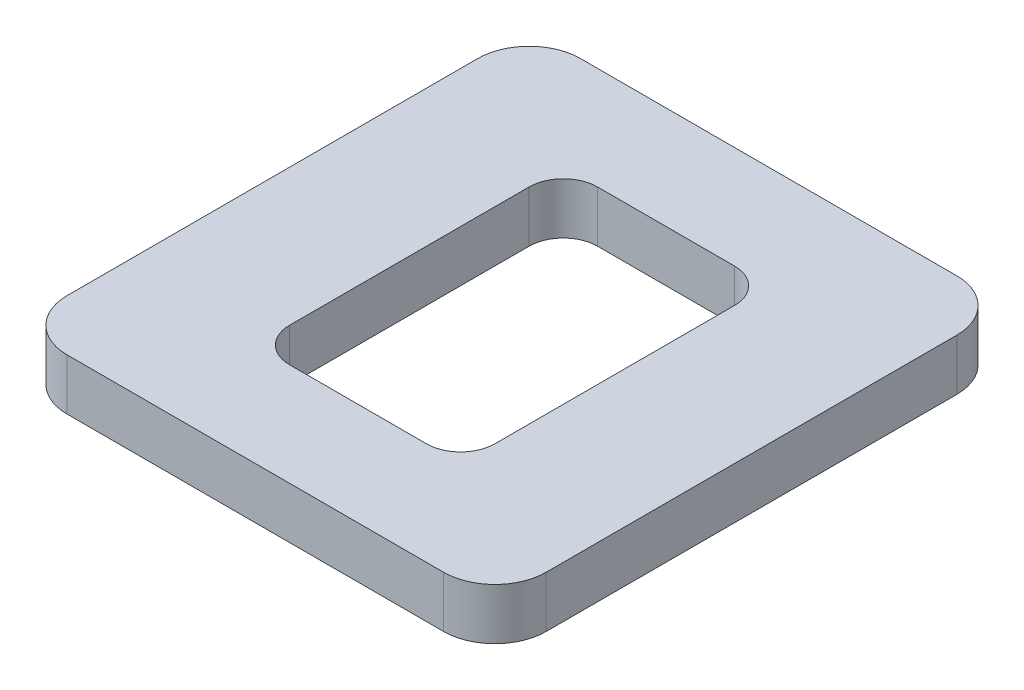
ISO-10303-21;
HEADER;
FILE_DESCRIPTION(('STEP AP214'),'2;1');
FILE_NAME('part.step','',(''),(''),'','','');
FILE_SCHEMA(('AUTOMOTIVE_DESIGN { 1 0 10303 214 1 1 1 1 }'));
ENDSEC;
DATA;
#1=APPLICATION_CONTEXT('core data for automotive mechanical design processes');
#2=APPLICATION_PROTOCOL_DEFINITION('international standard','automotive_design',2000,#1);
#3=PRODUCT_CONTEXT('',#1,'mechanical');
#4=PRODUCT('Part','Part','',(#3));
#5=PRODUCT_RELATED_PRODUCT_CATEGORY('part','',(#4));
#6=PRODUCT_DEFINITION_FORMATION('','',#4);
#7=PRODUCT_DEFINITION_CONTEXT('part definition',#1,'design');
#8=PRODUCT_DEFINITION('design','',#6,#7);
#9=PRODUCT_DEFINITION_SHAPE('','',#8);
#10=(LENGTH_UNIT() NAMED_UNIT(*) SI_UNIT(.MILLI.,.METRE.));
#11=(NAMED_UNIT(*) PLANE_ANGLE_UNIT() SI_UNIT($,.RADIAN.));
#12=(NAMED_UNIT(*) SI_UNIT($,.STERADIAN.) SOLID_ANGLE_UNIT());
#13=UNCERTAINTY_MEASURE_WITH_UNIT(LENGTH_MEASURE(1.E-05),#10,'distance_accuracy_value','');
#14=(GEOMETRIC_REPRESENTATION_CONTEXT(3) GLOBAL_UNCERTAINTY_ASSIGNED_CONTEXT((#13)) GLOBAL_UNIT_ASSIGNED_CONTEXT((#10,
#11,#12)) REPRESENTATION_CONTEXT('',''));
#15=CARTESIAN_POINT('',(0.,0.,0.));
#16=DIRECTION('',(0.,0.,1.));
#17=DIRECTION('',(1.,0.,0.));
#18=AXIS2_PLACEMENT_3D('',#15,#16,#17);
#19=CARTESIAN_POINT('',(-11.,90.,40.));
#20=DIRECTION('',(0.,1.,0.));
#21=DIRECTION('',(0.,0.,1.));
#22=AXIS2_PLACEMENT_3D('',#19,#20,#21);
#23=PLANE('',#22);
#24=CARTESIAN_POINT('',(-11.,90.,40.));
#25=DIRECTION('',(0.,1.,0.));
#26=DIRECTION('',(0.,0.,1.));
#27=AXIS2_PLACEMENT_3D('',#24,#25,#26);
#28=CIRCLE('',#27,3.);
#29=CARTESIAN_POINT('',(-14.,90.,40.));
#30=VERTEX_POINT('',#29);
#31=CARTESIAN_POINT('',(-11.,90.,43.));
#32=VERTEX_POINT('',#31);
#33=EDGE_CURVE('E219',#30,#32,#28,.T.);
#34=ORIENTED_EDGE('',*,*,#33,.T.);
#35=DIRECTION('',(1.,0.,0.));
#36=VECTOR('',#35,1.);
#37=CARTESIAN_POINT('',(-11.,90.,43.));
#38=LINE('',#37,#36);
#39=CARTESIAN_POINT('',(11.,90.,43.));
#40=VERTEX_POINT('',#39);
#41=EDGE_CURVE('E222',#32,#40,#38,.T.);
#42=ORIENTED_EDGE('',*,*,#41,.T.);
#43=CARTESIAN_POINT('',(11.,90.,40.));
#44=DIRECTION('',(0.,1.,0.));
#45=DIRECTION('',(0.,0.,1.));
#46=AXIS2_PLACEMENT_3D('',#43,#44,#45);
#47=CIRCLE('',#46,3.);
#48=CARTESIAN_POINT('',(14.,90.,40.));
#49=VERTEX_POINT('',#48);
#50=EDGE_CURVE('E225',#40,#49,#47,.T.);
#51=ORIENTED_EDGE('',*,*,#50,.T.);
#52=DIRECTION('',(0.,0.,-1.));
#53=VECTOR('',#52,1.);
#54=CARTESIAN_POINT('',(14.,90.,40.));
#55=LINE('',#54,#53);
#56=CARTESIAN_POINT('',(14.,90.,16.));
#57=VERTEX_POINT('',#56);
#58=EDGE_CURVE('E227',#49,#57,#55,.T.);
#59=ORIENTED_EDGE('',*,*,#58,.T.);
#60=CARTESIAN_POINT('',(11.,90.,16.));
#61=DIRECTION('',(0.,1.,0.));
#62=DIRECTION('',(0.,0.,1.));
#63=AXIS2_PLACEMENT_3D('',#60,#61,#62);
#64=CIRCLE('',#63,3.);
#65=CARTESIAN_POINT('',(11.,90.,13.));
#66=VERTEX_POINT('',#65);
#67=EDGE_CURVE('E229',#57,#66,#64,.T.);
#68=ORIENTED_EDGE('',*,*,#67,.T.);
#69=DIRECTION('',(-1.,0.,0.));
#70=VECTOR('',#69,1.);
#71=CARTESIAN_POINT('',(11.,90.,13.));
#72=LINE('',#71,#70);
#73=CARTESIAN_POINT('',(-11.,90.,13.));
#74=VERTEX_POINT('',#73);
#75=EDGE_CURVE('E231',#66,#74,#72,.T.);
#76=ORIENTED_EDGE('',*,*,#75,.T.);
#77=CARTESIAN_POINT('',(-11.,90.,16.));
#78=DIRECTION('',(0.,1.,0.));
#79=DIRECTION('',(0.,0.,1.));
#80=AXIS2_PLACEMENT_3D('',#77,#78,#79);
#81=CIRCLE('',#80,3.);
#82=CARTESIAN_POINT('',(-14.,90.,16.));
#83=VERTEX_POINT('',#82);
#84=EDGE_CURVE('E233',#74,#83,#81,.T.);
#85=ORIENTED_EDGE('',*,*,#84,.T.);
#86=DIRECTION('',(0.,0.,1.));
#87=VECTOR('',#86,1.);
#88=CARTESIAN_POINT('',(-14.,90.,16.));
#89=LINE('',#88,#87);
#90=EDGE_CURVE('E235',#83,#30,#89,.T.);
#91=ORIENTED_EDGE('',*,*,#90,.T.);
#92=EDGE_LOOP('',(#34,#42,#51,#59,#68,#76,#85,#91));
#93=FACE_BOUND('',#92,.T.);
#94=DIRECTION('',(1.,0.,0.));
#95=VECTOR('',#94,1.);
#96=CARTESIAN_POINT('',(-4.,90.,37.));
#97=LINE('',#96,#95);
#98=CARTESIAN_POINT('',(-4.,90.,37.));
#99=VERTEX_POINT('',#98);
#100=CARTESIAN_POINT('',(4.,90.,37.));
#101=VERTEX_POINT('',#100);
#102=EDGE_CURVE('E162',#99,#101,#97,.T.);
#103=ORIENTED_EDGE('',*,*,#102,.F.);
#104=CARTESIAN_POINT('',(-4.,90.,35.));
#105=DIRECTION('',(0.,1.,0.));
#106=DIRECTION('',(0.,0.,1.));
#107=AXIS2_PLACEMENT_3D('',#104,#105,#106);
#108=CIRCLE('',#107,2.);
#109=CARTESIAN_POINT('',(-6.,90.,35.));
#110=VERTEX_POINT('',#109);
#111=EDGE_CURVE('E154',#110,#99,#108,.T.);
#112=ORIENTED_EDGE('',*,*,#111,.F.);
#113=DIRECTION('',(0.,0.,1.));
#114=VECTOR('',#113,1.);
#115=CARTESIAN_POINT('',(-6.,90.,21.));
#116=LINE('',#115,#114);
#117=CARTESIAN_POINT('',(-6.,90.,21.));
#118=VERTEX_POINT('',#117);
#119=EDGE_CURVE('E187',#118,#110,#116,.T.);
#120=ORIENTED_EDGE('',*,*,#119,.F.);
#121=CARTESIAN_POINT('',(-4.,90.,21.));
#122=DIRECTION('',(0.,1.,0.));
#123=DIRECTION('',(0.,0.,1.));
#124=AXIS2_PLACEMENT_3D('',#121,#122,#123);
#125=CIRCLE('',#124,2.);
#126=CARTESIAN_POINT('',(-4.,90.,19.));
#127=VERTEX_POINT('',#126);
#128=EDGE_CURVE('E185',#127,#118,#125,.T.);
#129=ORIENTED_EDGE('',*,*,#128,.F.);
#130=DIRECTION('',(-1.,0.,0.));
#131=VECTOR('',#130,1.);
#132=CARTESIAN_POINT('',(4.,90.,19.));
#133=LINE('',#132,#131);
#134=CARTESIAN_POINT('',(4.,90.,19.));
#135=VERTEX_POINT('',#134);
#136=EDGE_CURVE('E183',#135,#127,#133,.T.);
#137=ORIENTED_EDGE('',*,*,#136,.F.);
#138=CARTESIAN_POINT('',(4.,90.,21.));
#139=DIRECTION('',(0.,1.,0.));
#140=DIRECTION('',(0.,0.,1.));
#141=AXIS2_PLACEMENT_3D('',#138,#139,#140);
#142=CIRCLE('',#141,2.);
#143=CARTESIAN_POINT('',(6.,90.,21.));
#144=VERTEX_POINT('',#143);
#145=EDGE_CURVE('E181',#144,#135,#142,.T.);
#146=ORIENTED_EDGE('',*,*,#145,.F.);
#147=DIRECTION('',(0.,0.,-1.));
#148=VECTOR('',#147,1.);
#149=CARTESIAN_POINT('',(6.,90.,35.));
#150=LINE('',#149,#148);
#151=CARTESIAN_POINT('',(6.,90.,35.));
#152=VERTEX_POINT('',#151);
#153=EDGE_CURVE('E177',#152,#144,#150,.T.);
#154=ORIENTED_EDGE('',*,*,#153,.F.);
#155=CARTESIAN_POINT('',(4.,90.,35.));
#156=DIRECTION('',(0.,1.,0.));
#157=DIRECTION('',(0.,0.,1.));
#158=AXIS2_PLACEMENT_3D('',#155,#156,#157);
#159=CIRCLE('',#158,2.);
#160=EDGE_CURVE('E175',#101,#152,#159,.T.);
#161=ORIENTED_EDGE('',*,*,#160,.F.);
#162=EDGE_LOOP('',(#103,#112,#120,#129,#137,#146,#154,#161));
#163=FACE_BOUND('',#162,.T.);
#164=ADVANCED_FACE('F41',(#93,#163),#23,.T.);
#165=CARTESIAN_POINT('',(-11.,87.,40.));
#166=DIRECTION('',(0.,1.,0.));
#167=DIRECTION('',(0.,0.,1.));
#168=AXIS2_PLACEMENT_3D('',#165,#166,#167);
#169=PLANE('',#168);
#170=CARTESIAN_POINT('',(-11.,87.,40.));
#171=DIRECTION('',(0.,1.,0.));
#172=DIRECTION('',(0.,0.,1.));
#173=AXIS2_PLACEMENT_3D('',#170,#171,#172);
#174=CIRCLE('',#173,3.);
#175=CARTESIAN_POINT('',(-14.,87.,40.));
#176=VERTEX_POINT('',#175);
#177=CARTESIAN_POINT('',(-11.,87.,43.));
#178=VERTEX_POINT('',#177);
#179=EDGE_CURVE('E170',#176,#178,#174,.T.);
#180=ORIENTED_EDGE('',*,*,#179,.F.);
#181=DIRECTION('',(0.,0.,1.));
#182=VECTOR('',#181,1.);
#183=CARTESIAN_POINT('',(-14.,87.,16.));
#184=LINE('',#183,#182);
#185=CARTESIAN_POINT('',(-14.,87.,16.));
#186=VERTEX_POINT('',#185);
#187=EDGE_CURVE('E223',#186,#176,#184,.T.);
#188=ORIENTED_EDGE('',*,*,#187,.F.);
#189=CARTESIAN_POINT('',(-11.,87.,16.));
#190=DIRECTION('',(0.,1.,0.));
#191=DIRECTION('',(0.,0.,1.));
#192=AXIS2_PLACEMENT_3D('',#189,#190,#191);
#193=CIRCLE('',#192,3.);
#194=CARTESIAN_POINT('',(-11.,87.,13.));
#195=VERTEX_POINT('',#194);
#196=EDGE_CURVE('E250',#195,#186,#193,.T.);
#197=ORIENTED_EDGE('',*,*,#196,.F.);
#198=DIRECTION('',(-1.,0.,0.));
#199=VECTOR('',#198,1.);
#200=CARTESIAN_POINT('',(11.,87.,13.));
#201=LINE('',#200,#199);
#202=CARTESIAN_POINT('',(11.,87.,13.));
#203=VERTEX_POINT('',#202);
#204=EDGE_CURVE('E248',#203,#195,#201,.T.);
#205=ORIENTED_EDGE('',*,*,#204,.F.);
#206=CARTESIAN_POINT('',(11.,87.,16.));
#207=DIRECTION('',(0.,1.,0.));
#208=DIRECTION('',(0.,0.,1.));
#209=AXIS2_PLACEMENT_3D('',#206,#207,#208);
#210=CIRCLE('',#209,3.);
#211=CARTESIAN_POINT('',(14.,87.,16.));
#212=VERTEX_POINT('',#211);
#213=EDGE_CURVE('E246',#212,#203,#210,.T.);
#214=ORIENTED_EDGE('',*,*,#213,.F.);
#215=DIRECTION('',(0.,0.,-1.));
#216=VECTOR('',#215,1.);
#217=CARTESIAN_POINT('',(14.,87.,40.));
#218=LINE('',#217,#216);
#219=CARTESIAN_POINT('',(14.,87.,40.));
#220=VERTEX_POINT('',#219);
#221=EDGE_CURVE('E244',#220,#212,#218,.T.);
#222=ORIENTED_EDGE('',*,*,#221,.F.);
#223=CARTESIAN_POINT('',(11.,87.,40.));
#224=DIRECTION('',(0.,1.,0.));
#225=DIRECTION('',(0.,0.,1.));
#226=AXIS2_PLACEMENT_3D('',#223,#224,#225);
#227=CIRCLE('',#226,3.);
#228=CARTESIAN_POINT('',(11.,87.,43.));
#229=VERTEX_POINT('',#228);
#230=EDGE_CURVE('E242',#229,#220,#227,.T.);
#231=ORIENTED_EDGE('',*,*,#230,.F.);
#232=DIRECTION('',(1.,0.,0.));
#233=VECTOR('',#232,1.);
#234=CARTESIAN_POINT('',(-11.,87.,43.));
#235=LINE('',#234,#233);
#236=EDGE_CURVE('E240',#178,#229,#235,.T.);
#237=ORIENTED_EDGE('',*,*,#236,.F.);
#238=EDGE_LOOP('',(#180,#188,#197,#205,#214,#222,#231,#237));
#239=FACE_BOUND('',#238,.T.);
#240=CARTESIAN_POINT('',(-4.,87.,35.));
#241=DIRECTION('',(0.,1.,0.));
#242=DIRECTION('',(0.,0.,1.));
#243=AXIS2_PLACEMENT_3D('',#240,#241,#242);
#244=CIRCLE('',#243,2.);
#245=CARTESIAN_POINT('',(-6.,87.,35.));
#246=VERTEX_POINT('',#245);
#247=CARTESIAN_POINT('',(-4.,87.,37.));
#248=VERTEX_POINT('',#247);
#249=EDGE_CURVE('E64',#246,#248,#244,.T.);
#250=ORIENTED_EDGE('',*,*,#249,.T.);
#251=DIRECTION('',(1.,0.,0.));
#252=VECTOR('',#251,1.);
#253=CARTESIAN_POINT('',(-4.,87.,37.));
#254=LINE('',#253,#252);
#255=CARTESIAN_POINT('',(4.,87.,37.));
#256=VERTEX_POINT('',#255);
#257=EDGE_CURVE('E169',#248,#256,#254,.T.);
#258=ORIENTED_EDGE('',*,*,#257,.T.);
#259=CARTESIAN_POINT('',(4.,87.,35.));
#260=DIRECTION('',(0.,1.,0.));
#261=DIRECTION('',(0.,0.,1.));
#262=AXIS2_PLACEMENT_3D('',#259,#260,#261);
#263=CIRCLE('',#262,2.);
#264=CARTESIAN_POINT('',(6.,87.,35.));
#265=VERTEX_POINT('',#264);
#266=EDGE_CURVE('E191',#256,#265,#263,.T.);
#267=ORIENTED_EDGE('',*,*,#266,.T.);
#268=DIRECTION('',(0.,0.,-1.));
#269=VECTOR('',#268,1.);
#270=CARTESIAN_POINT('',(6.,87.,35.));
#271=LINE('',#270,#269);
#272=CARTESIAN_POINT('',(6.,87.,21.));
#273=VERTEX_POINT('',#272);
#274=EDGE_CURVE('E194',#265,#273,#271,.T.);
#275=ORIENTED_EDGE('',*,*,#274,.T.);
#276=CARTESIAN_POINT('',(4.,87.,21.));
#277=DIRECTION('',(0.,1.,0.));
#278=DIRECTION('',(0.,0.,1.));
#279=AXIS2_PLACEMENT_3D('',#276,#277,#278);
#280=CIRCLE('',#279,2.);
#281=CARTESIAN_POINT('',(4.,87.,19.));
#282=VERTEX_POINT('',#281);
#283=EDGE_CURVE('E197',#273,#282,#280,.T.);
#284=ORIENTED_EDGE('',*,*,#283,.T.);
#285=DIRECTION('',(-1.,0.,0.));
#286=VECTOR('',#285,1.);
#287=CARTESIAN_POINT('',(4.,87.,19.));
#288=LINE('',#287,#286);
#289=CARTESIAN_POINT('',(-4.,87.,19.));
#290=VERTEX_POINT('',#289);
#291=EDGE_CURVE('E200',#282,#290,#288,.T.);
#292=ORIENTED_EDGE('',*,*,#291,.T.);
#293=CARTESIAN_POINT('',(-4.,87.,21.));
#294=DIRECTION('',(0.,1.,0.));
#295=DIRECTION('',(0.,0.,1.));
#296=AXIS2_PLACEMENT_3D('',#293,#294,#295);
#297=CIRCLE('',#296,2.);
#298=CARTESIAN_POINT('',(-6.,87.,21.));
#299=VERTEX_POINT('',#298);
#300=EDGE_CURVE('E203',#290,#299,#297,.T.);
#301=ORIENTED_EDGE('',*,*,#300,.T.);
#302=DIRECTION('',(0.,0.,1.));
#303=VECTOR('',#302,1.);
#304=CARTESIAN_POINT('',(-6.,87.,21.));
#305=LINE('',#304,#303);
#306=EDGE_CURVE('E163',#299,#246,#305,.T.);
#307=ORIENTED_EDGE('',*,*,#306,.T.);
#308=EDGE_LOOP('',(#250,#258,#267,#275,#284,#292,#301,#307));
#309=FACE_BOUND('',#308,.T.);
#310=ADVANCED_FACE('F280',(#239,#309),#169,.F.);
#311=CARTESIAN_POINT('',(-11.,90.,40.));
#312=DIRECTION('',(0.,-1.,0.));
#313=DIRECTION('',(0.,0.,-1.));
#314=AXIS2_PLACEMENT_3D('',#311,#312,#313);
#315=CYLINDRICAL_SURFACE('',#314,3.);
#316=ORIENTED_EDGE('',*,*,#179,.T.);
#317=DIRECTION('',(0.,-1.,0.));
#318=VECTOR('',#317,1.);
#319=CARTESIAN_POINT('',(-11.,90.,43.));
#320=LINE('',#319,#318);
#321=EDGE_CURVE('E11',#32,#178,#320,.T.);
#322=ORIENTED_EDGE('',*,*,#321,.F.);
#323=ORIENTED_EDGE('',*,*,#33,.F.);
#324=DIRECTION('',(0.,-1.,0.));
#325=VECTOR('',#324,1.);
#326=CARTESIAN_POINT('',(-14.,90.,40.));
#327=LINE('',#326,#325);
#328=EDGE_CURVE('E237',#30,#176,#327,.T.);
#329=ORIENTED_EDGE('',*,*,#328,.T.);
#330=EDGE_LOOP('',(#316,#322,#323,#329));
#331=FACE_BOUND('',#330,.T.);
#332=ADVANCED_FACE('F43',(#331),#315,.T.);
#333=CARTESIAN_POINT('',(-11.,90.,43.));
#334=DIRECTION('',(0.,0.,-1.));
#335=DIRECTION('',(-1.,0.,0.));
#336=AXIS2_PLACEMENT_3D('',#333,#334,#335);
#337=PLANE('',#336);
#338=ORIENTED_EDGE('',*,*,#236,.T.);
#339=DIRECTION('',(0.,-1.,0.));
#340=VECTOR('',#339,1.);
#341=CARTESIAN_POINT('',(11.,90.,43.));
#342=LINE('',#341,#340);
#343=EDGE_CURVE('E49',#40,#229,#342,.T.);
#344=ORIENTED_EDGE('',*,*,#343,.F.);
#345=ORIENTED_EDGE('',*,*,#41,.F.);
#346=ORIENTED_EDGE('',*,*,#321,.T.);
#347=EDGE_LOOP('',(#338,#344,#345,#346));
#348=FACE_BOUND('',#347,.T.);
#349=ADVANCED_FACE('F297',(#348),#337,.F.);
#350=CARTESIAN_POINT('',(11.,90.,40.));
#351=DIRECTION('',(0.,-1.,0.));
#352=DIRECTION('',(0.,0.,-1.));
#353=AXIS2_PLACEMENT_3D('',#350,#351,#352);
#354=CYLINDRICAL_SURFACE('',#353,3.);
#355=ORIENTED_EDGE('',*,*,#230,.T.);
#356=DIRECTION('',(0.,-1.,0.));
#357=VECTOR('',#356,1.);
#358=CARTESIAN_POINT('',(14.,90.,40.));
#359=LINE('',#358,#357);
#360=EDGE_CURVE('E267',#49,#220,#359,.T.);
#361=ORIENTED_EDGE('',*,*,#360,.F.);
#362=ORIENTED_EDGE('',*,*,#50,.F.);
#363=ORIENTED_EDGE('',*,*,#343,.T.);
#364=EDGE_LOOP('',(#355,#361,#362,#363));
#365=FACE_BOUND('',#364,.T.);
#366=ADVANCED_FACE('F274',(#365),#354,.T.);
#367=CARTESIAN_POINT('',(14.,90.,40.));
#368=DIRECTION('',(-1.,0.,0.));
#369=DIRECTION('',(0.,0.,1.));
#370=AXIS2_PLACEMENT_3D('',#367,#368,#369);
#371=PLANE('',#370);
#372=ORIENTED_EDGE('',*,*,#221,.T.);
#373=DIRECTION('',(0.,-1.,0.));
#374=VECTOR('',#373,1.);
#375=CARTESIAN_POINT('',(14.,90.,16.));
#376=LINE('',#375,#374);
#377=EDGE_CURVE('E264',#57,#212,#376,.T.);
#378=ORIENTED_EDGE('',*,*,#377,.F.);
#379=ORIENTED_EDGE('',*,*,#58,.F.);
#380=ORIENTED_EDGE('',*,*,#360,.T.);
#381=EDGE_LOOP('',(#372,#378,#379,#380));
#382=FACE_BOUND('',#381,.T.);
#383=ADVANCED_FACE('F286',(#382),#371,.F.);
#384=CARTESIAN_POINT('',(11.,90.,16.));
#385=DIRECTION('',(0.,-1.,0.));
#386=DIRECTION('',(0.,0.,-1.));
#387=AXIS2_PLACEMENT_3D('',#384,#385,#386);
#388=CYLINDRICAL_SURFACE('',#387,3.);
#389=ORIENTED_EDGE('',*,*,#213,.T.);
#390=DIRECTION('',(0.,-1.,0.));
#391=VECTOR('',#390,1.);
#392=CARTESIAN_POINT('',(11.,90.,13.));
#393=LINE('',#392,#391);
#394=EDGE_CURVE('E261',#66,#203,#393,.T.);
#395=ORIENTED_EDGE('',*,*,#394,.F.);
#396=ORIENTED_EDGE('',*,*,#67,.F.);
#397=ORIENTED_EDGE('',*,*,#377,.T.);
#398=EDGE_LOOP('',(#389,#395,#396,#397));
#399=FACE_BOUND('',#398,.T.);
#400=ADVANCED_FACE('F290',(#399),#388,.T.);
#401=CARTESIAN_POINT('',(11.,90.,13.));
#402=DIRECTION('',(0.,0.,1.));
#403=DIRECTION('',(1.,0.,0.));
#404=AXIS2_PLACEMENT_3D('',#401,#402,#403);
#405=PLANE('',#404);
#406=ORIENTED_EDGE('',*,*,#204,.T.);
#407=DIRECTION('',(0.,-1.,0.));
#408=VECTOR('',#407,1.);
#409=CARTESIAN_POINT('',(-11.,90.,13.));
#410=LINE('',#409,#408);
#411=EDGE_CURVE('E258',#74,#195,#410,.T.);
#412=ORIENTED_EDGE('',*,*,#411,.F.);
#413=ORIENTED_EDGE('',*,*,#75,.F.);
#414=ORIENTED_EDGE('',*,*,#394,.T.);
#415=EDGE_LOOP('',(#406,#412,#413,#414));
#416=FACE_BOUND('',#415,.T.);
#417=ADVANCED_FACE('F310',(#416),#405,.F.);
#418=CARTESIAN_POINT('',(-11.,90.,16.));
#419=DIRECTION('',(0.,-1.,0.));
#420=DIRECTION('',(0.,0.,-1.));
#421=AXIS2_PLACEMENT_3D('',#418,#419,#420);
#422=CYLINDRICAL_SURFACE('',#421,3.);
#423=ORIENTED_EDGE('',*,*,#196,.T.);
#424=DIRECTION('',(0.,-1.,0.));
#425=VECTOR('',#424,1.);
#426=CARTESIAN_POINT('',(-14.,90.,16.));
#427=LINE('',#426,#425);
#428=EDGE_CURVE('E255',#83,#186,#427,.T.);
#429=ORIENTED_EDGE('',*,*,#428,.F.);
#430=ORIENTED_EDGE('',*,*,#84,.F.);
#431=ORIENTED_EDGE('',*,*,#411,.T.);
#432=EDGE_LOOP('',(#423,#429,#430,#431));
#433=FACE_BOUND('',#432,.T.);
#434=ADVANCED_FACE('F308',(#433),#422,.T.);
#435=CARTESIAN_POINT('',(-14.,90.,16.));
#436=DIRECTION('',(1.,0.,0.));
#437=DIRECTION('',(0.,0.,-1.));
#438=AXIS2_PLACEMENT_3D('',#435,#436,#437);
#439=PLANE('',#438);
#440=ORIENTED_EDGE('',*,*,#187,.T.);
#441=ORIENTED_EDGE('',*,*,#328,.F.);
#442=ORIENTED_EDGE('',*,*,#90,.F.);
#443=ORIENTED_EDGE('',*,*,#428,.T.);
#444=EDGE_LOOP('',(#440,#441,#442,#443));
#445=FACE_BOUND('',#444,.T.);
#446=ADVANCED_FACE('F303',(#445),#439,.F.);
#447=CARTESIAN_POINT('',(-4.,90.,35.));
#448=DIRECTION('',(0.,-1.,0.));
#449=DIRECTION('',(0.,0.,-1.));
#450=AXIS2_PLACEMENT_3D('',#447,#448,#449);
#451=CYLINDRICAL_SURFACE('',#450,2.);
#452=ORIENTED_EDGE('',*,*,#249,.F.);
#453=DIRECTION('',(0.,-1.,0.));
#454=VECTOR('',#453,1.);
#455=CARTESIAN_POINT('',(-6.,90.,35.));
#456=LINE('',#455,#454);
#457=EDGE_CURVE('E158',#110,#246,#456,.T.);
#458=ORIENTED_EDGE('',*,*,#457,.F.);
#459=ORIENTED_EDGE('',*,*,#111,.T.);
#460=DIRECTION('',(0.,-1.,0.));
#461=VECTOR('',#460,1.);
#462=CARTESIAN_POINT('',(-4.,90.,37.));
#463=LINE('',#462,#461);
#464=EDGE_CURVE('E157',#99,#248,#463,.T.);
#465=ORIENTED_EDGE('',*,*,#464,.T.);
#466=EDGE_LOOP('',(#452,#458,#459,#465));
#467=FACE_BOUND('',#466,.T.);
#468=ADVANCED_FACE('F156',(#467),#451,.F.);
#469=CARTESIAN_POINT('',(-4.,90.,37.));
#470=DIRECTION('',(0.,0.,-1.));
#471=DIRECTION('',(-1.,0.,0.));
#472=AXIS2_PLACEMENT_3D('',#469,#470,#471);
#473=PLANE('',#472);
#474=ORIENTED_EDGE('',*,*,#257,.F.);
#475=ORIENTED_EDGE('',*,*,#464,.F.);
#476=ORIENTED_EDGE('',*,*,#102,.T.);
#477=DIRECTION('',(0.,-1.,0.));
#478=VECTOR('',#477,1.);
#479=CARTESIAN_POINT('',(4.,90.,37.));
#480=LINE('',#479,#478);
#481=EDGE_CURVE('E171',#101,#256,#480,.T.);
#482=ORIENTED_EDGE('',*,*,#481,.T.);
#483=EDGE_LOOP('',(#474,#475,#476,#482));
#484=FACE_BOUND('',#483,.T.);
#485=ADVANCED_FACE('F166',(#484),#473,.T.);
#486=CARTESIAN_POINT('',(4.,90.,35.));
#487=DIRECTION('',(0.,-1.,0.));
#488=DIRECTION('',(0.,0.,-1.));
#489=AXIS2_PLACEMENT_3D('',#486,#487,#488);
#490=CYLINDRICAL_SURFACE('',#489,2.);
#491=ORIENTED_EDGE('',*,*,#266,.F.);
#492=ORIENTED_EDGE('',*,*,#481,.F.);
#493=ORIENTED_EDGE('',*,*,#160,.T.);
#494=DIRECTION('',(0.,-1.,0.));
#495=VECTOR('',#494,1.);
#496=CARTESIAN_POINT('',(6.,90.,35.));
#497=LINE('',#496,#495);
#498=EDGE_CURVE('E216',#152,#265,#497,.T.);
#499=ORIENTED_EDGE('',*,*,#498,.T.);
#500=EDGE_LOOP('',(#491,#492,#493,#499));
#501=FACE_BOUND('',#500,.T.);
#502=ADVANCED_FACE('F335',(#501),#490,.F.);
#503=CARTESIAN_POINT('',(6.,90.,35.));
#504=DIRECTION('',(-1.,0.,0.));
#505=DIRECTION('',(0.,0.,1.));
#506=AXIS2_PLACEMENT_3D('',#503,#504,#505);
#507=PLANE('',#506);
#508=ORIENTED_EDGE('',*,*,#274,.F.);
#509=ORIENTED_EDGE('',*,*,#498,.F.);
#510=ORIENTED_EDGE('',*,*,#153,.T.);
#511=DIRECTION('',(0.,-1.,0.));
#512=VECTOR('',#511,1.);
#513=CARTESIAN_POINT('',(6.,90.,21.));
#514=LINE('',#513,#512);
#515=EDGE_CURVE('E214',#144,#273,#514,.T.);
#516=ORIENTED_EDGE('',*,*,#515,.T.);
#517=EDGE_LOOP('',(#508,#509,#510,#516));
#518=FACE_BOUND('',#517,.T.);
#519=ADVANCED_FACE('F339',(#518),#507,.T.);
#520=CARTESIAN_POINT('',(4.,90.,21.));
#521=DIRECTION('',(0.,-1.,0.));
#522=DIRECTION('',(0.,0.,-1.));
#523=AXIS2_PLACEMENT_3D('',#520,#521,#522);
#524=CYLINDRICAL_SURFACE('',#523,2.);
#525=ORIENTED_EDGE('',*,*,#283,.F.);
#526=ORIENTED_EDGE('',*,*,#515,.F.);
#527=ORIENTED_EDGE('',*,*,#145,.T.);
#528=DIRECTION('',(0.,-1.,0.));
#529=VECTOR('',#528,1.);
#530=CARTESIAN_POINT('',(4.,90.,19.));
#531=LINE('',#530,#529);
#532=EDGE_CURVE('E212',#135,#282,#531,.T.);
#533=ORIENTED_EDGE('',*,*,#532,.T.);
#534=EDGE_LOOP('',(#525,#526,#527,#533));
#535=FACE_BOUND('',#534,.T.);
#536=ADVANCED_FACE('F345',(#535),#524,.F.);
#537=CARTESIAN_POINT('',(4.,90.,19.));
#538=DIRECTION('',(0.,0.,1.));
#539=DIRECTION('',(1.,0.,0.));
#540=AXIS2_PLACEMENT_3D('',#537,#538,#539);
#541=PLANE('',#540);
#542=ORIENTED_EDGE('',*,*,#291,.F.);
#543=ORIENTED_EDGE('',*,*,#532,.F.);
#544=ORIENTED_EDGE('',*,*,#136,.T.);
#545=DIRECTION('',(0.,-1.,0.));
#546=VECTOR('',#545,1.);
#547=CARTESIAN_POINT('',(-4.,90.,19.));
#548=LINE('',#547,#546);
#549=EDGE_CURVE('E210',#127,#290,#548,.T.);
#550=ORIENTED_EDGE('',*,*,#549,.T.);
#551=EDGE_LOOP('',(#542,#543,#544,#550));
#552=FACE_BOUND('',#551,.T.);
#553=ADVANCED_FACE('F349',(#552),#541,.T.);
#554=CARTESIAN_POINT('',(-4.,90.,21.));
#555=DIRECTION('',(0.,-1.,0.));
#556=DIRECTION('',(0.,0.,-1.));
#557=AXIS2_PLACEMENT_3D('',#554,#555,#556);
#558=CYLINDRICAL_SURFACE('',#557,2.);
#559=ORIENTED_EDGE('',*,*,#300,.F.);
#560=ORIENTED_EDGE('',*,*,#549,.F.);
#561=ORIENTED_EDGE('',*,*,#128,.T.);
#562=DIRECTION('',(0.,-1.,0.));
#563=VECTOR('',#562,1.);
#564=CARTESIAN_POINT('',(-6.,90.,21.));
#565=LINE('',#564,#563);
#566=EDGE_CURVE('E56',#118,#299,#565,.T.);
#567=ORIENTED_EDGE('',*,*,#566,.T.);
#568=EDGE_LOOP('',(#559,#560,#561,#567));
#569=FACE_BOUND('',#568,.T.);
#570=ADVANCED_FACE('F353',(#569),#558,.F.);
#571=CARTESIAN_POINT('',(-6.,90.,21.));
#572=DIRECTION('',(1.,0.,0.));
#573=DIRECTION('',(0.,0.,-1.));
#574=AXIS2_PLACEMENT_3D('',#571,#572,#573);
#575=PLANE('',#574);
#576=ORIENTED_EDGE('',*,*,#306,.F.);
#577=ORIENTED_EDGE('',*,*,#566,.F.);
#578=ORIENTED_EDGE('',*,*,#119,.T.);
#579=ORIENTED_EDGE('',*,*,#457,.T.);
#580=EDGE_LOOP('',(#576,#577,#578,#579));
#581=FACE_BOUND('',#580,.T.);
#582=ADVANCED_FACE('F357',(#581),#575,.T.);
#583=CLOSED_SHELL('',(#164,#310,#332,#349,#366,#383,#400,#417,#434,#446,#468,#485,#502,#519,
#536,#553,#570,#582));
#584=MANIFOLD_SOLID_BREP('B2',#583);
#585=ADVANCED_BREP_SHAPE_REPRESENTATION('',(#18,#584),#14);
#586=SHAPE_DEFINITION_REPRESENTATION(#9,#585);
ENDSEC;
END-ISO-10303-21;
